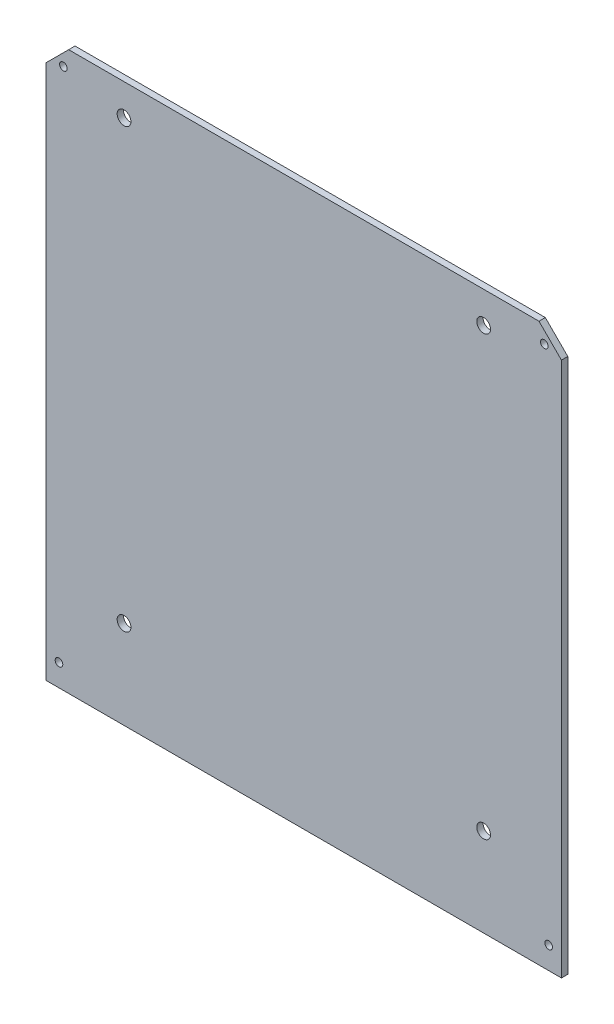
ISO-10303-21;
HEADER;
FILE_DESCRIPTION(('STEP AP214'),'2;1');
FILE_NAME('part.step','',(''),(''),'','','');
FILE_SCHEMA(('AUTOMOTIVE_DESIGN { 1 0 10303 214 1 1 1 1 }'));
ENDSEC;
DATA;
#1=APPLICATION_CONTEXT('core data for automotive mechanical design processes');
#2=APPLICATION_PROTOCOL_DEFINITION('international standard','automotive_design',2000,#1);
#3=PRODUCT_CONTEXT('',#1,'mechanical');
#4=PRODUCT('Part','Part','',(#3));
#5=PRODUCT_RELATED_PRODUCT_CATEGORY('part','',(#4));
#6=PRODUCT_DEFINITION_FORMATION('','',#4);
#7=PRODUCT_DEFINITION_CONTEXT('part definition',#1,'design');
#8=PRODUCT_DEFINITION('design','',#6,#7);
#9=PRODUCT_DEFINITION_SHAPE('','',#8);
#10=(LENGTH_UNIT() NAMED_UNIT(*) SI_UNIT(.MILLI.,.METRE.));
#11=(NAMED_UNIT(*) PLANE_ANGLE_UNIT() SI_UNIT($,.RADIAN.));
#12=(NAMED_UNIT(*) SI_UNIT($,.STERADIAN.) SOLID_ANGLE_UNIT());
#13=UNCERTAINTY_MEASURE_WITH_UNIT(LENGTH_MEASURE(1.E-05),#10,'distance_accuracy_value','');
#14=(GEOMETRIC_REPRESENTATION_CONTEXT(3) GLOBAL_UNCERTAINTY_ASSIGNED_CONTEXT((#13)) GLOBAL_UNIT_ASSIGNED_CONTEXT((#10,
#11,#12)) REPRESENTATION_CONTEXT('',''));
#15=CARTESIAN_POINT('',(0.,0.,0.));
#16=DIRECTION('',(0.,0.,1.));
#17=DIRECTION('',(1.,0.,0.));
#18=AXIS2_PLACEMENT_3D('',#15,#16,#17);
#19=CARTESIAN_POINT('',(0.,0.,3.));
#20=DIRECTION('',(0.,0.,-1.));
#21=DIRECTION('',(-1.,0.,0.));
#22=AXIS2_PLACEMENT_3D('',#19,#20,#21);
#23=PLANE('',#22);
#24=CARTESIAN_POINT('',(-115.75,-106.346194077712,3.));
#25=DIRECTION('',(0.,0.,-1.));
#26=DIRECTION('',(-1.,0.,0.));
#27=AXIS2_PLACEMENT_3D('',#24,#25,#26);
#28=CIRCLE('',#27,1.8);
#29=CARTESIAN_POINT('',(-117.55,-106.346194077712,3.));
#30=VERTEX_POINT('',#29);
#31=EDGE_CURVE('E176',#30,#30,#28,.T.);
#32=ORIENTED_EDGE('',*,*,#31,.T.);
#33=EDGE_LOOP('',(#32));
#34=FACE_BOUND('',#33,.T.);
#35=CARTESIAN_POINT('',(113.67588386093,138.67588386093,3.));
#36=DIRECTION('',(0.,0.,-1.));
#37=DIRECTION('',(-1.,0.,0.));
#38=AXIS2_PLACEMENT_3D('',#35,#36,#37);
#39=CIRCLE('',#38,1.8);
#40=CARTESIAN_POINT('',(111.87588386093,138.67588386093,3.));
#41=VERTEX_POINT('',#40);
#42=EDGE_CURVE('E179',#41,#41,#39,.T.);
#43=ORIENTED_EDGE('',*,*,#42,.T.);
#44=EDGE_LOOP('',(#43));
#45=FACE_BOUND('',#44,.T.);
#46=CARTESIAN_POINT('',(-113.67588386093,138.67588386093,3.));
#47=DIRECTION('',(0.,0.,-1.));
#48=DIRECTION('',(-1.,0.,0.));
#49=AXIS2_PLACEMENT_3D('',#46,#47,#48);
#50=CIRCLE('',#49,1.8);
#51=CARTESIAN_POINT('',(-115.47588386093,138.67588386093,3.));
#52=VERTEX_POINT('',#51);
#53=EDGE_CURVE('E52',#52,#52,#50,.T.);
#54=ORIENTED_EDGE('',*,*,#53,.T.);
#55=EDGE_LOOP('',(#54));
#56=FACE_BOUND('',#55,.T.);
#57=CARTESIAN_POINT('',(115.75,-106.346194077713,3.));
#58=DIRECTION('',(0.,0.,-1.));
#59=DIRECTION('',(-1.,0.,0.));
#60=AXIS2_PLACEMENT_3D('',#57,#58,#59);
#61=CIRCLE('',#60,1.8);
#62=CARTESIAN_POINT('',(113.95,-106.346194077713,3.));
#63=VERTEX_POINT('',#62);
#64=EDGE_CURVE('E11',#63,#63,#61,.T.);
#65=ORIENTED_EDGE('',*,*,#64,.T.);
#66=EDGE_LOOP('',(#65));
#67=FACE_BOUND('',#66,.T.);
#68=CARTESIAN_POINT('',(85.,-74.9999999999999,3.));
#69=DIRECTION('',(0.,0.,-1.));
#70=DIRECTION('',(-1.,0.,0.));
#71=AXIS2_PLACEMENT_3D('',#68,#69,#70);
#72=CIRCLE('',#71,3.25000000000001);
#73=CARTESIAN_POINT('',(81.75,-74.9999999999999,3.));
#74=VERTEX_POINT('',#73);
#75=EDGE_CURVE('E150',#74,#74,#72,.T.);
#76=ORIENTED_EDGE('',*,*,#75,.T.);
#77=EDGE_LOOP('',(#76));
#78=FACE_BOUND('',#77,.T.);
#79=CARTESIAN_POINT('',(85.,132.,3.));
#80=DIRECTION('',(0.,0.,-1.));
#81=DIRECTION('',(-1.,0.,0.));
#82=AXIS2_PLACEMENT_3D('',#79,#80,#81);
#83=CIRCLE('',#82,3.25000000000001);
#84=CARTESIAN_POINT('',(81.75,132.,3.));
#85=VERTEX_POINT('',#84);
#86=EDGE_CURVE('E154',#85,#85,#83,.T.);
#87=ORIENTED_EDGE('',*,*,#86,.T.);
#88=EDGE_LOOP('',(#87));
#89=FACE_BOUND('',#88,.T.);
#90=CARTESIAN_POINT('',(-85.,132.,3.));
#91=DIRECTION('',(0.,0.,-1.));
#92=DIRECTION('',(-1.,0.,0.));
#93=AXIS2_PLACEMENT_3D('',#90,#91,#92);
#94=CIRCLE('',#93,3.25000000000001);
#95=CARTESIAN_POINT('',(-88.25,132.,3.));
#96=VERTEX_POINT('',#95);
#97=EDGE_CURVE('E158',#96,#96,#94,.T.);
#98=ORIENTED_EDGE('',*,*,#97,.T.);
#99=EDGE_LOOP('',(#98));
#100=FACE_BOUND('',#99,.T.);
#101=CARTESIAN_POINT('',(-85.,-75.,3.));
#102=DIRECTION('',(0.,0.,-1.));
#103=DIRECTION('',(-1.,0.,0.));
#104=AXIS2_PLACEMENT_3D('',#101,#102,#103);
#105=CIRCLE('',#104,3.25000000000001);
#106=CARTESIAN_POINT('',(-88.25,-75.,3.));
#107=VERTEX_POINT('',#106);
#108=EDGE_CURVE('E161',#107,#107,#105,.T.);
#109=ORIENTED_EDGE('',*,*,#108,.T.);
#110=EDGE_LOOP('',(#109));
#111=FACE_BOUND('',#110,.T.);
#112=DIRECTION('',(0.707106781186547,-0.707106781186548,0.));
#113=VECTOR('',#112,1.);
#114=CARTESIAN_POINT('',(111.174516600406,146.8,3.));
#115=LINE('',#114,#113);
#116=CARTESIAN_POINT('',(111.174516600406,146.8,3.));
#117=VERTEX_POINT('',#116);
#118=CARTESIAN_POINT('',(121.8,136.174516600406,3.));
#119=VERTEX_POINT('',#118);
#120=EDGE_CURVE('E60',#117,#119,#115,.T.);
#121=ORIENTED_EDGE('',*,*,#120,.F.);
#122=DIRECTION('',(1.,0.,0.));
#123=VECTOR('',#122,1.);
#124=CARTESIAN_POINT('',(-111.174516600406,146.8,3.));
#125=LINE('',#124,#123);
#126=CARTESIAN_POINT('',(-111.174516600406,146.8,3.));
#127=VERTEX_POINT('',#126);
#128=EDGE_CURVE('E121',#127,#117,#125,.T.);
#129=ORIENTED_EDGE('',*,*,#128,.F.);
#130=DIRECTION('',(0.707106781186548,0.707106781186547,0.));
#131=VECTOR('',#130,1.);
#132=CARTESIAN_POINT('',(-121.8,136.174516600406,3.));
#133=LINE('',#132,#131);
#134=CARTESIAN_POINT('',(-121.8,136.174516600406,3.));
#135=VERTEX_POINT('',#134);
#136=EDGE_CURVE('E119',#135,#127,#133,.T.);
#137=ORIENTED_EDGE('',*,*,#136,.F.);
#138=DIRECTION('',(0.,1.,0.));
#139=VECTOR('',#138,1.);
#140=CARTESIAN_POINT('',(-121.8,-116.8,3.));
#141=LINE('',#140,#139);
#142=CARTESIAN_POINT('',(-121.8,-116.8,3.));
#143=VERTEX_POINT('',#142);
#144=EDGE_CURVE('E102',#143,#135,#141,.T.);
#145=ORIENTED_EDGE('',*,*,#144,.F.);
#146=DIRECTION('',(-1.,0.,0.));
#147=VECTOR('',#146,1.);
#148=CARTESIAN_POINT('',(121.8,-116.8,3.));
#149=LINE('',#148,#147);
#150=CARTESIAN_POINT('',(121.8,-116.8,3.));
#151=VERTEX_POINT('',#150);
#152=EDGE_CURVE('E110',#151,#143,#149,.T.);
#153=ORIENTED_EDGE('',*,*,#152,.F.);
#154=DIRECTION('',(0.,-1.,0.));
#155=VECTOR('',#154,1.);
#156=CARTESIAN_POINT('',(121.8,136.174516600406,3.));
#157=LINE('',#156,#155);
#158=EDGE_CURVE('E115',#119,#151,#157,.T.);
#159=ORIENTED_EDGE('',*,*,#158,.F.);
#160=EDGE_LOOP('',(#121,#129,#137,#145,#153,#159));
#161=FACE_BOUND('',#160,.T.);
#162=ADVANCED_FACE('F43',(#34,#45,#56,#67,#78,#89,#100,#111,#161),#23,.F.);
#163=CARTESIAN_POINT('',(0.,0.,0.));
#164=DIRECTION('',(0.,0.,-1.));
#165=DIRECTION('',(-1.,0.,0.));
#166=AXIS2_PLACEMENT_3D('',#163,#164,#165);
#167=PLANE('',#166);
#168=CARTESIAN_POINT('',(-115.75,-106.346194077712,0.));
#169=DIRECTION('',(0.,0.,-1.));
#170=DIRECTION('',(-1.,0.,0.));
#171=AXIS2_PLACEMENT_3D('',#168,#169,#170);
#172=CIRCLE('',#171,1.8);
#173=CARTESIAN_POINT('',(-117.55,-106.346194077712,0.));
#174=VERTEX_POINT('',#173);
#175=EDGE_CURVE('E171',#174,#174,#172,.T.);
#176=ORIENTED_EDGE('',*,*,#175,.F.);
#177=EDGE_LOOP('',(#176));
#178=FACE_BOUND('',#177,.T.);
#179=CARTESIAN_POINT('',(113.67588386093,138.67588386093,0.));
#180=DIRECTION('',(0.,0.,-1.));
#181=DIRECTION('',(-1.,0.,0.));
#182=AXIS2_PLACEMENT_3D('',#179,#180,#181);
#183=CIRCLE('',#182,1.8);
#184=CARTESIAN_POINT('',(111.87588386093,138.67588386093,0.));
#185=VERTEX_POINT('',#184);
#186=EDGE_CURVE('E164',#185,#185,#183,.T.);
#187=ORIENTED_EDGE('',*,*,#186,.F.);
#188=EDGE_LOOP('',(#187));
#189=FACE_BOUND('',#188,.T.);
#190=CARTESIAN_POINT('',(-113.67588386093,138.67588386093,0.));
#191=DIRECTION('',(0.,0.,-1.));
#192=DIRECTION('',(-1.,0.,0.));
#193=AXIS2_PLACEMENT_3D('',#190,#191,#192);
#194=CIRCLE('',#193,1.8);
#195=CARTESIAN_POINT('',(-115.47588386093,138.67588386093,0.));
#196=VERTEX_POINT('',#195);
#197=EDGE_CURVE('E167',#196,#196,#194,.T.);
#198=ORIENTED_EDGE('',*,*,#197,.F.);
#199=EDGE_LOOP('',(#198));
#200=FACE_BOUND('',#199,.T.);
#201=CARTESIAN_POINT('',(115.75,-106.346194077713,0.));
#202=DIRECTION('',(0.,0.,-1.));
#203=DIRECTION('',(-1.,0.,0.));
#204=AXIS2_PLACEMENT_3D('',#201,#202,#203);
#205=CIRCLE('',#204,1.8);
#206=CARTESIAN_POINT('',(113.95,-106.346194077713,0.));
#207=VERTEX_POINT('',#206);
#208=EDGE_CURVE('E168',#207,#207,#205,.T.);
#209=ORIENTED_EDGE('',*,*,#208,.F.);
#210=EDGE_LOOP('',(#209));
#211=FACE_BOUND('',#210,.T.);
#212=CARTESIAN_POINT('',(85.,-74.9999999999999,0.));
#213=DIRECTION('',(0.,0.,-1.));
#214=DIRECTION('',(-1.,0.,0.));
#215=AXIS2_PLACEMENT_3D('',#212,#213,#214);
#216=CIRCLE('',#215,3.25000000000001);
#217=CARTESIAN_POINT('',(81.75,-74.9999999999999,0.));
#218=VERTEX_POINT('',#217);
#219=EDGE_CURVE('E144',#218,#218,#216,.T.);
#220=ORIENTED_EDGE('',*,*,#219,.F.);
#221=EDGE_LOOP('',(#220));
#222=FACE_BOUND('',#221,.T.);
#223=CARTESIAN_POINT('',(85.,132.,0.));
#224=DIRECTION('',(0.,0.,-1.));
#225=DIRECTION('',(-1.,0.,0.));
#226=AXIS2_PLACEMENT_3D('',#223,#224,#225);
#227=CIRCLE('',#226,3.25000000000001);
#228=CARTESIAN_POINT('',(81.75,132.,0.));
#229=VERTEX_POINT('',#228);
#230=EDGE_CURVE('E153',#229,#229,#227,.T.);
#231=ORIENTED_EDGE('',*,*,#230,.F.);
#232=EDGE_LOOP('',(#231));
#233=FACE_BOUND('',#232,.T.);
#234=CARTESIAN_POINT('',(-85.,132.,0.));
#235=DIRECTION('',(0.,0.,-1.));
#236=DIRECTION('',(-1.,0.,0.));
#237=AXIS2_PLACEMENT_3D('',#234,#235,#236);
#238=CIRCLE('',#237,3.25000000000001);
#239=CARTESIAN_POINT('',(-88.25,132.,0.));
#240=VERTEX_POINT('',#239);
#241=EDGE_CURVE('E157',#240,#240,#238,.T.);
#242=ORIENTED_EDGE('',*,*,#241,.F.);
#243=EDGE_LOOP('',(#242));
#244=FACE_BOUND('',#243,.T.);
#245=CARTESIAN_POINT('',(-85.,-75.,0.));
#246=DIRECTION('',(0.,0.,-1.));
#247=DIRECTION('',(-1.,0.,0.));
#248=AXIS2_PLACEMENT_3D('',#245,#246,#247);
#249=CIRCLE('',#248,3.25000000000001);
#250=CARTESIAN_POINT('',(-88.25,-75.,0.));
#251=VERTEX_POINT('',#250);
#252=EDGE_CURVE('E47',#251,#251,#249,.T.);
#253=ORIENTED_EDGE('',*,*,#252,.F.);
#254=EDGE_LOOP('',(#253));
#255=FACE_BOUND('',#254,.T.);
#256=DIRECTION('',(1.,0.,0.));
#257=VECTOR('',#256,1.);
#258=CARTESIAN_POINT('',(-111.174516600406,146.8,0.));
#259=LINE('',#258,#257);
#260=CARTESIAN_POINT('',(-111.174516600406,146.8,0.));
#261=VERTEX_POINT('',#260);
#262=CARTESIAN_POINT('',(111.174516600406,146.8,0.));
#263=VERTEX_POINT('',#262);
#264=EDGE_CURVE('E139',#261,#263,#259,.T.);
#265=ORIENTED_EDGE('',*,*,#264,.T.);
#266=DIRECTION('',(0.707106781186547,-0.707106781186548,0.));
#267=VECTOR('',#266,1.);
#268=CARTESIAN_POINT('',(111.174516600406,146.8,0.));
#269=LINE('',#268,#267);
#270=CARTESIAN_POINT('',(121.8,136.174516600406,0.));
#271=VERTEX_POINT('',#270);
#272=EDGE_CURVE('E128',#263,#271,#269,.T.);
#273=ORIENTED_EDGE('',*,*,#272,.T.);
#274=DIRECTION('',(0.,-1.,0.));
#275=VECTOR('',#274,1.);
#276=CARTESIAN_POINT('',(121.8,136.174516600406,0.));
#277=LINE('',#276,#275);
#278=CARTESIAN_POINT('',(121.8,-116.8,0.));
#279=VERTEX_POINT('',#278);
#280=EDGE_CURVE('E131',#271,#279,#277,.T.);
#281=ORIENTED_EDGE('',*,*,#280,.T.);
#282=DIRECTION('',(-1.,0.,0.));
#283=VECTOR('',#282,1.);
#284=CARTESIAN_POINT('',(121.8,-116.8,0.));
#285=LINE('',#284,#283);
#286=CARTESIAN_POINT('',(-121.8,-116.8,0.));
#287=VERTEX_POINT('',#286);
#288=EDGE_CURVE('E68',#279,#287,#285,.T.);
#289=ORIENTED_EDGE('',*,*,#288,.T.);
#290=DIRECTION('',(0.,1.,0.));
#291=VECTOR('',#290,1.);
#292=CARTESIAN_POINT('',(-121.8,-116.8,0.));
#293=LINE('',#292,#291);
#294=CARTESIAN_POINT('',(-121.8,136.174516600406,0.));
#295=VERTEX_POINT('',#294);
#296=EDGE_CURVE('E105',#287,#295,#293,.T.);
#297=ORIENTED_EDGE('',*,*,#296,.T.);
#298=DIRECTION('',(0.707106781186548,0.707106781186547,0.));
#299=VECTOR('',#298,1.);
#300=CARTESIAN_POINT('',(-121.8,136.174516600406,0.));
#301=LINE('',#300,#299);
#302=EDGE_CURVE('E136',#295,#261,#301,.T.);
#303=ORIENTED_EDGE('',*,*,#302,.T.);
#304=EDGE_LOOP('',(#265,#273,#281,#289,#297,#303));
#305=FACE_BOUND('',#304,.T.);
#306=ADVANCED_FACE('F45',(#178,#189,#200,#211,#222,#233,#244,#255,#305),#167,.T.);
#307=CARTESIAN_POINT('',(-115.75,-106.346194077712,11.));
#308=DIRECTION('',(0.,0.,-1.));
#309=DIRECTION('',(-1.,0.,0.));
#310=AXIS2_PLACEMENT_3D('',#307,#308,#309);
#311=CYLINDRICAL_SURFACE('',#310,1.8);
#312=ORIENTED_EDGE('',*,*,#175,.T.);
#313=EDGE_LOOP('',(#312));
#314=FACE_BOUND('',#313,.T.);
#315=ORIENTED_EDGE('',*,*,#31,.F.);
#316=EDGE_LOOP('',(#315));
#317=FACE_BOUND('',#316,.T.);
#318=ADVANCED_FACE('F195',(#314,#317),#311,.F.);
#319=CARTESIAN_POINT('',(113.67588386093,138.67588386093,11.));
#320=DIRECTION('',(0.,0.,-1.));
#321=DIRECTION('',(-1.,0.,0.));
#322=AXIS2_PLACEMENT_3D('',#319,#320,#321);
#323=CYLINDRICAL_SURFACE('',#322,1.8);
#324=ORIENTED_EDGE('',*,*,#186,.T.);
#325=EDGE_LOOP('',(#324));
#326=FACE_BOUND('',#325,.T.);
#327=ORIENTED_EDGE('',*,*,#42,.F.);
#328=EDGE_LOOP('',(#327));
#329=FACE_BOUND('',#328,.T.);
#330=ADVANCED_FACE('F227',(#326,#329),#323,.F.);
#331=CARTESIAN_POINT('',(-113.67588386093,138.67588386093,11.));
#332=DIRECTION('',(0.,0.,-1.));
#333=DIRECTION('',(-1.,0.,0.));
#334=AXIS2_PLACEMENT_3D('',#331,#332,#333);
#335=CYLINDRICAL_SURFACE('',#334,1.8);
#336=ORIENTED_EDGE('',*,*,#197,.T.);
#337=EDGE_LOOP('',(#336));
#338=FACE_BOUND('',#337,.T.);
#339=ORIENTED_EDGE('',*,*,#53,.F.);
#340=EDGE_LOOP('',(#339));
#341=FACE_BOUND('',#340,.T.);
#342=ADVANCED_FACE('F229',(#338,#341),#335,.F.);
#343=CARTESIAN_POINT('',(115.75,-106.346194077713,11.));
#344=DIRECTION('',(0.,0.,-1.));
#345=DIRECTION('',(-1.,0.,0.));
#346=AXIS2_PLACEMENT_3D('',#343,#344,#345);
#347=CYLINDRICAL_SURFACE('',#346,1.8);
#348=ORIENTED_EDGE('',*,*,#208,.T.);
#349=EDGE_LOOP('',(#348));
#350=FACE_BOUND('',#349,.T.);
#351=ORIENTED_EDGE('',*,*,#64,.F.);
#352=EDGE_LOOP('',(#351));
#353=FACE_BOUND('',#352,.T.);
#354=ADVANCED_FACE('F232',(#350,#353),#347,.F.);
#355=CARTESIAN_POINT('',(85.,-74.9999999999999,24.));
#356=DIRECTION('',(0.,0.,-1.));
#357=DIRECTION('',(-1.,0.,0.));
#358=AXIS2_PLACEMENT_3D('',#355,#356,#357);
#359=CYLINDRICAL_SURFACE('',#358,3.25000000000001);
#360=ORIENTED_EDGE('',*,*,#219,.T.);
#361=EDGE_LOOP('',(#360));
#362=FACE_BOUND('',#361,.T.);
#363=ORIENTED_EDGE('',*,*,#75,.F.);
#364=EDGE_LOOP('',(#363));
#365=FACE_BOUND('',#364,.T.);
#366=ADVANCED_FACE('F236',(#362,#365),#359,.F.);
#367=CARTESIAN_POINT('',(85.,132.,24.));
#368=DIRECTION('',(0.,0.,-1.));
#369=DIRECTION('',(-1.,0.,0.));
#370=AXIS2_PLACEMENT_3D('',#367,#368,#369);
#371=CYLINDRICAL_SURFACE('',#370,3.25000000000001);
#372=ORIENTED_EDGE('',*,*,#230,.T.);
#373=EDGE_LOOP('',(#372));
#374=FACE_BOUND('',#373,.T.);
#375=ORIENTED_EDGE('',*,*,#86,.F.);
#376=EDGE_LOOP('',(#375));
#377=FACE_BOUND('',#376,.T.);
#378=ADVANCED_FACE('F243',(#374,#377),#371,.F.);
#379=CARTESIAN_POINT('',(-85.,132.,24.));
#380=DIRECTION('',(0.,0.,-1.));
#381=DIRECTION('',(-1.,0.,0.));
#382=AXIS2_PLACEMENT_3D('',#379,#380,#381);
#383=CYLINDRICAL_SURFACE('',#382,3.25000000000001);
#384=ORIENTED_EDGE('',*,*,#241,.T.);
#385=EDGE_LOOP('',(#384));
#386=FACE_BOUND('',#385,.T.);
#387=ORIENTED_EDGE('',*,*,#97,.F.);
#388=EDGE_LOOP('',(#387));
#389=FACE_BOUND('',#388,.T.);
#390=ADVANCED_FACE('F190',(#386,#389),#383,.F.);
#391=CARTESIAN_POINT('',(-85.,-75.,24.));
#392=DIRECTION('',(0.,0.,-1.));
#393=DIRECTION('',(-1.,0.,0.));
#394=AXIS2_PLACEMENT_3D('',#391,#392,#393);
#395=CYLINDRICAL_SURFACE('',#394,3.25000000000001);
#396=ORIENTED_EDGE('',*,*,#252,.T.);
#397=EDGE_LOOP('',(#396));
#398=FACE_BOUND('',#397,.T.);
#399=ORIENTED_EDGE('',*,*,#108,.F.);
#400=EDGE_LOOP('',(#399));
#401=FACE_BOUND('',#400,.T.);
#402=ADVANCED_FACE('F250',(#398,#401),#395,.F.);
#403=CARTESIAN_POINT('',(111.174516600406,146.8,3.));
#404=DIRECTION('',(0.707106781186548,0.707106781186547,0.));
#405=DIRECTION('',(-0.707106781186547,0.707106781186548,0.));
#406=AXIS2_PLACEMENT_3D('',#403,#404,#405);
#407=PLANE('',#406);
#408=ORIENTED_EDGE('',*,*,#272,.F.);
#409=DIRECTION('',(0.,0.,-1.));
#410=VECTOR('',#409,1.);
#411=CARTESIAN_POINT('',(111.174516600406,146.8,3.));
#412=LINE('',#411,#410);
#413=EDGE_CURVE('E142',#117,#263,#412,.T.);
#414=ORIENTED_EDGE('',*,*,#413,.F.);
#415=ORIENTED_EDGE('',*,*,#120,.T.);
#416=DIRECTION('',(0.,0.,-1.));
#417=VECTOR('',#416,1.);
#418=CARTESIAN_POINT('',(121.8,136.174516600406,3.));
#419=LINE('',#418,#417);
#420=EDGE_CURVE('E127',#119,#271,#419,.T.);
#421=ORIENTED_EDGE('',*,*,#420,.T.);
#422=EDGE_LOOP('',(#408,#414,#415,#421));
#423=FACE_BOUND('',#422,.T.);
#424=ADVANCED_FACE('F205',(#423),#407,.T.);
#425=CARTESIAN_POINT('',(-111.174516600406,146.8,3.));
#426=DIRECTION('',(0.,1.,0.));
#427=DIRECTION('',(0.,0.,1.));
#428=AXIS2_PLACEMENT_3D('',#425,#426,#427);
#429=PLANE('',#428);
#430=ORIENTED_EDGE('',*,*,#264,.F.);
#431=DIRECTION('',(0.,0.,-1.));
#432=VECTOR('',#431,1.);
#433=CARTESIAN_POINT('',(-111.174516600406,146.8,3.));
#434=LINE('',#433,#432);
#435=EDGE_CURVE('E145',#127,#261,#434,.T.);
#436=ORIENTED_EDGE('',*,*,#435,.F.);
#437=ORIENTED_EDGE('',*,*,#128,.T.);
#438=ORIENTED_EDGE('',*,*,#413,.T.);
#439=EDGE_LOOP('',(#430,#436,#437,#438));
#440=FACE_BOUND('',#439,.T.);
#441=ADVANCED_FACE('F204',(#440),#429,.T.);
#442=CARTESIAN_POINT('',(-121.8,136.174516600406,3.));
#443=DIRECTION('',(-0.707106781186547,0.707106781186548,0.));
#444=DIRECTION('',(-0.707106781186548,-0.707106781186547,0.));
#445=AXIS2_PLACEMENT_3D('',#442,#443,#444);
#446=PLANE('',#445);
#447=ORIENTED_EDGE('',*,*,#302,.F.);
#448=DIRECTION('',(0.,0.,-1.));
#449=VECTOR('',#448,1.);
#450=CARTESIAN_POINT('',(-121.8,136.174516600406,3.));
#451=LINE('',#450,#449);
#452=EDGE_CURVE('E106',#135,#295,#451,.T.);
#453=ORIENTED_EDGE('',*,*,#452,.F.);
#454=ORIENTED_EDGE('',*,*,#136,.T.);
#455=ORIENTED_EDGE('',*,*,#435,.T.);
#456=EDGE_LOOP('',(#447,#453,#454,#455));
#457=FACE_BOUND('',#456,.T.);
#458=ADVANCED_FACE('F258',(#457),#446,.T.);
#459=CARTESIAN_POINT('',(-121.8,-116.8,3.));
#460=DIRECTION('',(-1.,0.,0.));
#461=DIRECTION('',(0.,0.,1.));
#462=AXIS2_PLACEMENT_3D('',#459,#460,#461);
#463=PLANE('',#462);
#464=ORIENTED_EDGE('',*,*,#296,.F.);
#465=DIRECTION('',(0.,0.,-1.));
#466=VECTOR('',#465,1.);
#467=CARTESIAN_POINT('',(-121.8,-116.8,3.));
#468=LINE('',#467,#466);
#469=EDGE_CURVE('E98',#143,#287,#468,.T.);
#470=ORIENTED_EDGE('',*,*,#469,.F.);
#471=ORIENTED_EDGE('',*,*,#144,.T.);
#472=ORIENTED_EDGE('',*,*,#452,.T.);
#473=EDGE_LOOP('',(#464,#470,#471,#472));
#474=FACE_BOUND('',#473,.T.);
#475=ADVANCED_FACE('F100',(#474),#463,.T.);
#476=CARTESIAN_POINT('',(121.8,-116.8,3.));
#477=DIRECTION('',(0.,-1.,0.));
#478=DIRECTION('',(0.,0.,-1.));
#479=AXIS2_PLACEMENT_3D('',#476,#477,#478);
#480=PLANE('',#479);
#481=ORIENTED_EDGE('',*,*,#288,.F.);
#482=DIRECTION('',(0.,0.,-1.));
#483=VECTOR('',#482,1.);
#484=CARTESIAN_POINT('',(121.8,-116.8,3.));
#485=LINE('',#484,#483);
#486=EDGE_CURVE('E107',#151,#279,#485,.T.);
#487=ORIENTED_EDGE('',*,*,#486,.F.);
#488=ORIENTED_EDGE('',*,*,#152,.T.);
#489=ORIENTED_EDGE('',*,*,#469,.T.);
#490=EDGE_LOOP('',(#481,#487,#488,#489));
#491=FACE_BOUND('',#490,.T.);
#492=ADVANCED_FACE('F111',(#491),#480,.T.);
#493=CARTESIAN_POINT('',(121.8,136.174516600406,3.));
#494=DIRECTION('',(1.,0.,0.));
#495=DIRECTION('',(0.,0.,-1.));
#496=AXIS2_PLACEMENT_3D('',#493,#494,#495);
#497=PLANE('',#496);
#498=ORIENTED_EDGE('',*,*,#280,.F.);
#499=ORIENTED_EDGE('',*,*,#420,.F.);
#500=ORIENTED_EDGE('',*,*,#158,.T.);
#501=ORIENTED_EDGE('',*,*,#486,.T.);
#502=EDGE_LOOP('',(#498,#499,#500,#501));
#503=FACE_BOUND('',#502,.T.);
#504=ADVANCED_FACE('F208',(#503),#497,.T.);
#505=CLOSED_SHELL('',(#162,#306,#318,#330,#342,#354,#366,#378,#390,#402,#424,#441,#458,#475,
#492,#504));
#506=MANIFOLD_SOLID_BREP('B2',#505);
#507=ADVANCED_BREP_SHAPE_REPRESENTATION('',(#18,#506),#14);
#508=SHAPE_DEFINITION_REPRESENTATION(#9,#507);
ENDSEC;
END-ISO-10303-21;
